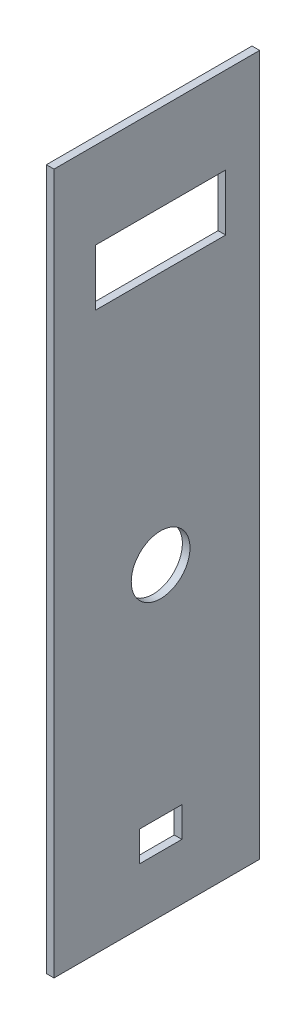
ISO-10303-21;
HEADER;
FILE_DESCRIPTION(('STEP AP214'),'2;1');
FILE_NAME('part.step','',(''),(''),'','','');
FILE_SCHEMA(('AUTOMOTIVE_DESIGN { 1 0 10303 214 1 1 1 1 }'));
ENDSEC;
DATA;
#1=APPLICATION_CONTEXT('core data for automotive mechanical design processes');
#2=APPLICATION_PROTOCOL_DEFINITION('international standard','automotive_design',2000,#1);
#3=PRODUCT_CONTEXT('',#1,'mechanical');
#4=PRODUCT('Part','Part','',(#3));
#5=PRODUCT_RELATED_PRODUCT_CATEGORY('part','',(#4));
#6=PRODUCT_DEFINITION_FORMATION('','',#4);
#7=PRODUCT_DEFINITION_CONTEXT('part definition',#1,'design');
#8=PRODUCT_DEFINITION('design','',#6,#7);
#9=PRODUCT_DEFINITION_SHAPE('','',#8);
#10=(LENGTH_UNIT() NAMED_UNIT(*) SI_UNIT(.MILLI.,.METRE.));
#11=(NAMED_UNIT(*) PLANE_ANGLE_UNIT() SI_UNIT($,.RADIAN.));
#12=(NAMED_UNIT(*) SI_UNIT($,.STERADIAN.) SOLID_ANGLE_UNIT());
#13=UNCERTAINTY_MEASURE_WITH_UNIT(LENGTH_MEASURE(1.E-05),#10,'distance_accuracy_value','');
#14=(GEOMETRIC_REPRESENTATION_CONTEXT(3) GLOBAL_UNCERTAINTY_ASSIGNED_CONTEXT((#13)) GLOBAL_UNIT_ASSIGNED_CONTEXT((#10,
#11,#12)) REPRESENTATION_CONTEXT('',''));
#15=CARTESIAN_POINT('',(0.,0.,0.));
#16=DIRECTION('',(0.,0.,1.));
#17=DIRECTION('',(1.,0.,0.));
#18=AXIS2_PLACEMENT_3D('',#15,#16,#17);
#19=CARTESIAN_POINT('',(3.175,0.,0.));
#20=DIRECTION('',(0.,1.,0.));
#21=DIRECTION('',(0.,0.,1.));
#22=AXIS2_PLACEMENT_3D('',#19,#20,#21);
#23=PLANE('',#22);
#24=DIRECTION('',(0.,0.,-1.));
#25=VECTOR('',#24,1.);
#26=CARTESIAN_POINT('',(0.,0.,0.));
#27=LINE('',#26,#25);
#28=CARTESIAN_POINT('',(0.,0.,3.17500000000001));
#29=VERTEX_POINT('',#28);
#30=CARTESIAN_POINT('',(0.,0.,-82.55));
#31=VERTEX_POINT('',#30);
#32=EDGE_CURVE('E146',#29,#31,#27,.T.);
#33=ORIENTED_EDGE('',*,*,#32,.T.);
#34=DIRECTION('',(-1.,0.,0.));
#35=VECTOR('',#34,1.);
#36=CARTESIAN_POINT('',(3.175,0.,-82.55));
#37=LINE('',#36,#35);
#38=CARTESIAN_POINT('',(3.175,0.,-82.55));
#39=VERTEX_POINT('',#38);
#40=EDGE_CURVE('E11',#39,#31,#37,.T.);
#41=ORIENTED_EDGE('',*,*,#40,.F.);
#42=DIRECTION('',(0.,0.,-1.));
#43=VECTOR('',#42,1.);
#44=CARTESIAN_POINT('',(3.175,0.,0.));
#45=LINE('',#44,#43);
#46=CARTESIAN_POINT('',(3.175,0.,3.17500000000001));
#47=VERTEX_POINT('',#46);
#48=EDGE_CURVE('E221',#47,#39,#45,.T.);
#49=ORIENTED_EDGE('',*,*,#48,.F.);
#50=DIRECTION('',(1.,0.,0.));
#51=VECTOR('',#50,1.);
#52=CARTESIAN_POINT('',(0.,0.,3.17500000000001));
#53=LINE('',#52,#51);
#54=EDGE_CURVE('E143',#29,#47,#53,.T.);
#55=ORIENTED_EDGE('',*,*,#54,.F.);
#56=EDGE_LOOP('',(#33,#41,#49,#55));
#57=FACE_BOUND('',#56,.T.);
#58=ADVANCED_FACE('F34',(#57),#23,.F.);
#59=CARTESIAN_POINT('',(3.175,0.,-82.55));
#60=DIRECTION('',(0.,0.,1.));
#61=DIRECTION('',(0.,-1.,0.));
#62=AXIS2_PLACEMENT_3D('',#59,#60,#61);
#63=PLANE('',#62);
#64=DIRECTION('',(0.,1.,0.));
#65=VECTOR('',#64,1.);
#66=CARTESIAN_POINT('',(0.,0.,-82.55));
#67=LINE('',#66,#65);
#68=CARTESIAN_POINT('',(0.,292.1,-82.5499999999999));
#69=VERTEX_POINT('',#68);
#70=EDGE_CURVE('E133',#31,#69,#67,.T.);
#71=ORIENTED_EDGE('',*,*,#70,.T.);
#72=DIRECTION('',(-1.,0.,0.));
#73=VECTOR('',#72,1.);
#74=CARTESIAN_POINT('',(3.175,292.1,-82.5499999999999));
#75=LINE('',#74,#73);
#76=CARTESIAN_POINT('',(3.175,292.1,-82.5499999999999));
#77=VERTEX_POINT('',#76);
#78=EDGE_CURVE('E38',#77,#69,#75,.T.);
#79=ORIENTED_EDGE('',*,*,#78,.F.);
#80=DIRECTION('',(0.,1.,0.));
#81=VECTOR('',#80,1.);
#82=CARTESIAN_POINT('',(3.175,0.,-82.55));
#83=LINE('',#82,#81);
#84=EDGE_CURVE('E219',#39,#77,#83,.T.);
#85=ORIENTED_EDGE('',*,*,#84,.F.);
#86=ORIENTED_EDGE('',*,*,#40,.T.);
#87=EDGE_LOOP('',(#71,#79,#85,#86));
#88=FACE_BOUND('',#87,.T.);
#89=ADVANCED_FACE('F228',(#88),#63,.F.);
#90=CARTESIAN_POINT('',(3.175,292.1,0.));
#91=DIRECTION('',(0.,1.,0.));
#92=DIRECTION('',(0.,0.,1.));
#93=AXIS2_PLACEMENT_3D('',#90,#91,#92);
#94=PLANE('',#93);
#95=DIRECTION('',(0.,0.,-1.));
#96=VECTOR('',#95,1.);
#97=CARTESIAN_POINT('',(0.,292.1,0.));
#98=LINE('',#97,#96);
#99=CARTESIAN_POINT('',(0.,292.1,3.17500000000001));
#100=VERTEX_POINT('',#99);
#101=EDGE_CURVE('E123',#100,#69,#98,.T.);
#102=ORIENTED_EDGE('',*,*,#101,.F.);
#103=DIRECTION('',(1.,0.,0.));
#104=VECTOR('',#103,1.);
#105=CARTESIAN_POINT('',(0.,292.1,3.17500000000001));
#106=LINE('',#105,#104);
#107=CARTESIAN_POINT('',(3.175,292.1,3.17500000000001));
#108=VERTEX_POINT('',#107);
#109=EDGE_CURVE('E126',#100,#108,#106,.T.);
#110=ORIENTED_EDGE('',*,*,#109,.T.);
#111=DIRECTION('',(0.,0.,-1.));
#112=VECTOR('',#111,1.);
#113=CARTESIAN_POINT('',(3.175,292.1,0.));
#114=LINE('',#113,#112);
#115=EDGE_CURVE('E217',#108,#77,#114,.T.);
#116=ORIENTED_EDGE('',*,*,#115,.T.);
#117=ORIENTED_EDGE('',*,*,#78,.T.);
#118=EDGE_LOOP('',(#102,#110,#116,#117));
#119=FACE_BOUND('',#118,.T.);
#120=ADVANCED_FACE('F36',(#119),#94,.T.);
#121=CARTESIAN_POINT('',(3.175,0.,0.));
#122=DIRECTION('',(-1.,0.,0.));
#123=DIRECTION('',(0.,0.,1.));
#124=AXIS2_PLACEMENT_3D('',#121,#122,#123);
#125=PLANE('',#124);
#126=DIRECTION('',(0.,0.,-1.));
#127=VECTOR('',#126,1.);
#128=CARTESIAN_POINT('',(3.175,232.5,-68.4));
#129=LINE('',#128,#127);
#130=CARTESIAN_POINT('',(3.175,232.5,-14.1499999999999));
#131=VERTEX_POINT('',#130);
#132=CARTESIAN_POINT('',(3.175,232.5,-68.4));
#133=VERTEX_POINT('',#132);
#134=EDGE_CURVE('E158',#131,#133,#129,.T.);
#135=ORIENTED_EDGE('',*,*,#134,.F.);
#136=DIRECTION('',(0.,-1.,0.));
#137=VECTOR('',#136,1.);
#138=CARTESIAN_POINT('',(3.175,232.5,-14.1499999999999));
#139=LINE('',#138,#137);
#140=CARTESIAN_POINT('',(3.175,256.,-14.1499999999999));
#141=VERTEX_POINT('',#140);
#142=EDGE_CURVE('E161',#141,#131,#139,.T.);
#143=ORIENTED_EDGE('',*,*,#142,.F.);
#144=DIRECTION('',(0.,0.,1.));
#145=VECTOR('',#144,1.);
#146=CARTESIAN_POINT('',(3.175,256.,-14.1499999999999));
#147=LINE('',#146,#145);
#148=CARTESIAN_POINT('',(3.175,256.,-68.4));
#149=VERTEX_POINT('',#148);
#150=EDGE_CURVE('E153',#149,#141,#147,.T.);
#151=ORIENTED_EDGE('',*,*,#150,.F.);
#152=DIRECTION('',(0.,1.,0.));
#153=VECTOR('',#152,1.);
#154=CARTESIAN_POINT('',(3.175,256.,-68.4));
#155=LINE('',#154,#153);
#156=EDGE_CURVE('E49',#133,#149,#155,.T.);
#157=ORIENTED_EDGE('',*,*,#156,.F.);
#158=EDGE_LOOP('',(#135,#143,#151,#157));
#159=FACE_BOUND('',#158,.T.);
#160=CARTESIAN_POINT('',(3.175,127.,-41.275));
#161=DIRECTION('',(-1.,0.,0.));
#162=DIRECTION('',(0.,0.,1.));
#163=AXIS2_PLACEMENT_3D('',#160,#161,#162);
#164=CIRCLE('',#163,12.25);
#165=CARTESIAN_POINT('',(3.175,127.,-29.025));
#166=VERTEX_POINT('',#165);
#167=EDGE_CURVE('E156',#166,#166,#164,.F.);
#168=ORIENTED_EDGE('',*,*,#167,.F.);
#169=EDGE_LOOP('',(#168));
#170=FACE_BOUND('',#169,.T.);
#171=DIRECTION('',(0.,0.,-1.));
#172=VECTOR('',#171,1.);
#173=CARTESIAN_POINT('',(3.175,23.4,-50.125));
#174=LINE('',#173,#172);
#175=CARTESIAN_POINT('',(3.175,23.4,-32.425));
#176=VERTEX_POINT('',#175);
#177=CARTESIAN_POINT('',(3.175,23.4,-50.125));
#178=VERTEX_POINT('',#177);
#179=EDGE_CURVE('E192',#176,#178,#174,.T.);
#180=ORIENTED_EDGE('',*,*,#179,.F.);
#181=DIRECTION('',(0.,-1.,0.));
#182=VECTOR('',#181,1.);
#183=CARTESIAN_POINT('',(3.175,23.4,-32.425));
#184=LINE('',#183,#182);
#185=CARTESIAN_POINT('',(3.175,35.95,-32.425));
#186=VERTEX_POINT('',#185);
#187=EDGE_CURVE('E195',#186,#176,#184,.T.);
#188=ORIENTED_EDGE('',*,*,#187,.F.);
#189=DIRECTION('',(0.,0.,1.));
#190=VECTOR('',#189,1.);
#191=CARTESIAN_POINT('',(3.175,35.95,-32.425));
#192=LINE('',#191,#190);
#193=CARTESIAN_POINT('',(3.175,35.95,-50.125));
#194=VERTEX_POINT('',#193);
#195=EDGE_CURVE('E151',#194,#186,#192,.T.);
#196=ORIENTED_EDGE('',*,*,#195,.F.);
#197=DIRECTION('',(0.,1.,0.));
#198=VECTOR('',#197,1.);
#199=CARTESIAN_POINT('',(3.175,35.95,-50.125));
#200=LINE('',#199,#198);
#201=EDGE_CURVE('E57',#178,#194,#200,.T.);
#202=ORIENTED_EDGE('',*,*,#201,.F.);
#203=EDGE_LOOP('',(#180,#188,#196,#202));
#204=FACE_BOUND('',#203,.T.);
#205=ORIENTED_EDGE('',*,*,#115,.F.);
#206=DIRECTION('',(0.,-1.,0.));
#207=VECTOR('',#206,1.);
#208=CARTESIAN_POINT('',(3.175,292.1,3.17500000000001));
#209=LINE('',#208,#207);
#210=EDGE_CURVE('E142',#108,#47,#209,.T.);
#211=ORIENTED_EDGE('',*,*,#210,.T.);
#212=ORIENTED_EDGE('',*,*,#48,.T.);
#213=ORIENTED_EDGE('',*,*,#84,.T.);
#214=EDGE_LOOP('',(#205,#211,#212,#213));
#215=FACE_BOUND('',#214,.T.);
#216=ADVANCED_FACE('F230',(#159,#170,#204,#215),#125,.F.);
#217=CARTESIAN_POINT('',(0.,0.,0.));
#218=DIRECTION('',(-1.,0.,0.));
#219=DIRECTION('',(0.,0.,1.));
#220=AXIS2_PLACEMENT_3D('',#217,#218,#219);
#221=PLANE('',#220);
#222=DIRECTION('',(0.,1.,0.));
#223=VECTOR('',#222,1.);
#224=CARTESIAN_POINT('',(0.,232.5,-14.1499999999999));
#225=LINE('',#224,#223);
#226=CARTESIAN_POINT('',(0.,232.5,-14.1499999999999));
#227=VERTEX_POINT('',#226);
#228=CARTESIAN_POINT('',(0.,256.,-14.1499999999999));
#229=VERTEX_POINT('',#228);
#230=EDGE_CURVE('E164',#227,#229,#225,.T.);
#231=ORIENTED_EDGE('',*,*,#230,.F.);
#232=DIRECTION('',(0.,0.,1.));
#233=VECTOR('',#232,1.);
#234=CARTESIAN_POINT('',(0.,232.5,-68.4));
#235=LINE('',#234,#233);
#236=CARTESIAN_POINT('',(0.,232.5,-68.4));
#237=VERTEX_POINT('',#236);
#238=EDGE_CURVE('E172',#237,#227,#235,.T.);
#239=ORIENTED_EDGE('',*,*,#238,.F.);
#240=DIRECTION('',(0.,-1.,0.));
#241=VECTOR('',#240,1.);
#242=CARTESIAN_POINT('',(0.,256.,-68.4));
#243=LINE('',#242,#241);
#244=CARTESIAN_POINT('',(0.,256.,-68.4));
#245=VERTEX_POINT('',#244);
#246=EDGE_CURVE('E169',#245,#237,#243,.T.);
#247=ORIENTED_EDGE('',*,*,#246,.F.);
#248=DIRECTION('',(0.,0.,-1.));
#249=VECTOR('',#248,1.);
#250=CARTESIAN_POINT('',(0.,256.,-14.1499999999999));
#251=LINE('',#250,#249);
#252=EDGE_CURVE('E166',#229,#245,#251,.T.);
#253=ORIENTED_EDGE('',*,*,#252,.F.);
#254=EDGE_LOOP('',(#231,#239,#247,#253));
#255=FACE_BOUND('',#254,.T.);
#256=CARTESIAN_POINT('',(0.,127.,-41.275));
#257=DIRECTION('',(-1.,0.,0.));
#258=DIRECTION('',(0.,0.,1.));
#259=AXIS2_PLACEMENT_3D('',#256,#257,#258);
#260=CIRCLE('',#259,12.25);
#261=CARTESIAN_POINT('',(0.,127.,-29.025));
#262=VERTEX_POINT('',#261);
#263=EDGE_CURVE('E185',#262,#262,#260,.T.);
#264=ORIENTED_EDGE('',*,*,#263,.F.);
#265=EDGE_LOOP('',(#264));
#266=FACE_BOUND('',#265,.T.);
#267=DIRECTION('',(0.,1.,0.));
#268=VECTOR('',#267,1.);
#269=CARTESIAN_POINT('',(0.,23.4,-32.425));
#270=LINE('',#269,#268);
#271=CARTESIAN_POINT('',(0.,23.4,-32.425));
#272=VERTEX_POINT('',#271);
#273=CARTESIAN_POINT('',(0.,35.95,-32.425));
#274=VERTEX_POINT('',#273);
#275=EDGE_CURVE('E198',#272,#274,#270,.T.);
#276=ORIENTED_EDGE('',*,*,#275,.F.);
#277=DIRECTION('',(0.,0.,1.));
#278=VECTOR('',#277,1.);
#279=CARTESIAN_POINT('',(0.,23.4,-50.125));
#280=LINE('',#279,#278);
#281=CARTESIAN_POINT('',(0.,23.4,-50.125));
#282=VERTEX_POINT('',#281);
#283=EDGE_CURVE('E206',#282,#272,#280,.T.);
#284=ORIENTED_EDGE('',*,*,#283,.F.);
#285=DIRECTION('',(0.,-1.,0.));
#286=VECTOR('',#285,1.);
#287=CARTESIAN_POINT('',(0.,35.95,-50.125));
#288=LINE('',#287,#286);
#289=CARTESIAN_POINT('',(0.,35.95,-50.125));
#290=VERTEX_POINT('',#289);
#291=EDGE_CURVE('E203',#290,#282,#288,.T.);
#292=ORIENTED_EDGE('',*,*,#291,.F.);
#293=DIRECTION('',(0.,0.,-1.));
#294=VECTOR('',#293,1.);
#295=CARTESIAN_POINT('',(0.,35.95,-32.425));
#296=LINE('',#295,#294);
#297=EDGE_CURVE('E200',#274,#290,#296,.T.);
#298=ORIENTED_EDGE('',*,*,#297,.F.);
#299=EDGE_LOOP('',(#276,#284,#292,#298));
#300=FACE_BOUND('',#299,.T.);
#301=ORIENTED_EDGE('',*,*,#32,.F.);
#302=DIRECTION('',(0.,-1.,0.));
#303=VECTOR('',#302,1.);
#304=CARTESIAN_POINT('',(0.,292.1,3.17500000000001));
#305=LINE('',#304,#303);
#306=EDGE_CURVE('E140',#100,#29,#305,.T.);
#307=ORIENTED_EDGE('',*,*,#306,.F.);
#308=ORIENTED_EDGE('',*,*,#101,.T.);
#309=ORIENTED_EDGE('',*,*,#70,.F.);
#310=EDGE_LOOP('',(#301,#307,#308,#309));
#311=FACE_BOUND('',#310,.T.);
#312=ADVANCED_FACE('F145',(#255,#266,#300,#311),#221,.T.);
#313=CARTESIAN_POINT('',(3.176,23.4,-32.425));
#314=DIRECTION('',(0.,0.,1.));
#315=DIRECTION('',(1.,0.,0.));
#316=AXIS2_PLACEMENT_3D('',#313,#314,#315);
#317=PLANE('',#316);
#318=ORIENTED_EDGE('',*,*,#187,.T.);
#319=DIRECTION('',(-1.,0.,0.));
#320=VECTOR('',#319,1.);
#321=CARTESIAN_POINT('',(3.176,23.4,-32.425));
#322=LINE('',#321,#320);
#323=EDGE_CURVE('E188',#176,#272,#322,.T.);
#324=ORIENTED_EDGE('',*,*,#323,.T.);
#325=ORIENTED_EDGE('',*,*,#275,.T.);
#326=DIRECTION('',(-1.,0.,0.));
#327=VECTOR('',#326,1.);
#328=CARTESIAN_POINT('',(3.176,35.95,-32.425));
#329=LINE('',#328,#327);
#330=EDGE_CURVE('E209',#186,#274,#329,.T.);
#331=ORIENTED_EDGE('',*,*,#330,.F.);
#332=EDGE_LOOP('',(#318,#324,#325,#331));
#333=FACE_BOUND('',#332,.T.);
#334=ADVANCED_FACE('F238',(#333),#317,.F.);
#335=CARTESIAN_POINT('',(3.176,23.4,-50.125));
#336=DIRECTION('',(0.,-1.,0.));
#337=DIRECTION('',(0.,0.,-1.));
#338=AXIS2_PLACEMENT_3D('',#335,#336,#337);
#339=PLANE('',#338);
#340=ORIENTED_EDGE('',*,*,#179,.T.);
#341=DIRECTION('',(-1.,0.,0.));
#342=VECTOR('',#341,1.);
#343=CARTESIAN_POINT('',(3.176,23.4,-50.125));
#344=LINE('',#343,#342);
#345=EDGE_CURVE('E211',#178,#282,#344,.T.);
#346=ORIENTED_EDGE('',*,*,#345,.T.);
#347=ORIENTED_EDGE('',*,*,#283,.T.);
#348=ORIENTED_EDGE('',*,*,#323,.F.);
#349=EDGE_LOOP('',(#340,#346,#347,#348));
#350=FACE_BOUND('',#349,.T.);
#351=ADVANCED_FACE('F336',(#350),#339,.F.);
#352=CARTESIAN_POINT('',(3.176,35.95,-50.125));
#353=DIRECTION('',(0.,0.,-1.));
#354=DIRECTION('',(-1.,0.,0.));
#355=AXIS2_PLACEMENT_3D('',#352,#353,#354);
#356=PLANE('',#355);
#357=ORIENTED_EDGE('',*,*,#201,.T.);
#358=DIRECTION('',(-1.,0.,0.));
#359=VECTOR('',#358,1.);
#360=CARTESIAN_POINT('',(3.176,35.95,-50.125));
#361=LINE('',#360,#359);
#362=EDGE_CURVE('E213',#194,#290,#361,.T.);
#363=ORIENTED_EDGE('',*,*,#362,.T.);
#364=ORIENTED_EDGE('',*,*,#291,.T.);
#365=ORIENTED_EDGE('',*,*,#345,.F.);
#366=EDGE_LOOP('',(#357,#363,#364,#365));
#367=FACE_BOUND('',#366,.T.);
#368=ADVANCED_FACE('F327',(#367),#356,.F.);
#369=CARTESIAN_POINT('',(3.176,35.95,-32.425));
#370=DIRECTION('',(0.,1.,0.));
#371=DIRECTION('',(0.,0.,1.));
#372=AXIS2_PLACEMENT_3D('',#369,#370,#371);
#373=PLANE('',#372);
#374=ORIENTED_EDGE('',*,*,#195,.T.);
#375=ORIENTED_EDGE('',*,*,#330,.T.);
#376=ORIENTED_EDGE('',*,*,#297,.T.);
#377=ORIENTED_EDGE('',*,*,#362,.F.);
#378=EDGE_LOOP('',(#374,#375,#376,#377));
#379=FACE_BOUND('',#378,.T.);
#380=ADVANCED_FACE('F318',(#379),#373,.F.);
#381=CARTESIAN_POINT('',(3.176,127.,-41.275));
#382=DIRECTION('',(-1.,0.,0.));
#383=DIRECTION('',(0.,0.,1.));
#384=AXIS2_PLACEMENT_3D('',#381,#382,#383);
#385=CYLINDRICAL_SURFACE('',#384,12.25);
#386=ORIENTED_EDGE('',*,*,#263,.T.);
#387=EDGE_LOOP('',(#386));
#388=FACE_BOUND('',#387,.T.);
#389=ORIENTED_EDGE('',*,*,#167,.T.);
#390=EDGE_LOOP('',(#389));
#391=FACE_BOUND('',#390,.T.);
#392=ADVANCED_FACE('F309',(#388,#391),#385,.F.);
#393=CARTESIAN_POINT('',(3.176,232.5,-14.1499999999999));
#394=DIRECTION('',(0.,0.,1.));
#395=DIRECTION('',(1.,0.,0.));
#396=AXIS2_PLACEMENT_3D('',#393,#394,#395);
#397=PLANE('',#396);
#398=ORIENTED_EDGE('',*,*,#142,.T.);
#399=DIRECTION('',(-1.,0.,0.));
#400=VECTOR('',#399,1.);
#401=CARTESIAN_POINT('',(3.176,232.5,-14.1499999999999));
#402=LINE('',#401,#400);
#403=EDGE_CURVE('E134',#131,#227,#402,.T.);
#404=ORIENTED_EDGE('',*,*,#403,.T.);
#405=ORIENTED_EDGE('',*,*,#230,.T.);
#406=DIRECTION('',(-1.,0.,0.));
#407=VECTOR('',#406,1.);
#408=CARTESIAN_POINT('',(3.176,256.,-14.1499999999999));
#409=LINE('',#408,#407);
#410=EDGE_CURVE('E175',#141,#229,#409,.T.);
#411=ORIENTED_EDGE('',*,*,#410,.F.);
#412=EDGE_LOOP('',(#398,#404,#405,#411));
#413=FACE_BOUND('',#412,.T.);
#414=ADVANCED_FACE('F300',(#413),#397,.F.);
#415=CARTESIAN_POINT('',(3.176,232.5,-68.4));
#416=DIRECTION('',(0.,-1.,0.));
#417=DIRECTION('',(0.,0.,-1.));
#418=AXIS2_PLACEMENT_3D('',#415,#416,#417);
#419=PLANE('',#418);
#420=ORIENTED_EDGE('',*,*,#134,.T.);
#421=DIRECTION('',(-1.,0.,0.));
#422=VECTOR('',#421,1.);
#423=CARTESIAN_POINT('',(3.176,232.5,-68.4));
#424=LINE('',#423,#422);
#425=EDGE_CURVE('E177',#133,#237,#424,.T.);
#426=ORIENTED_EDGE('',*,*,#425,.T.);
#427=ORIENTED_EDGE('',*,*,#238,.T.);
#428=ORIENTED_EDGE('',*,*,#403,.F.);
#429=EDGE_LOOP('',(#420,#426,#427,#428));
#430=FACE_BOUND('',#429,.T.);
#431=ADVANCED_FACE('F292',(#430),#419,.F.);
#432=CARTESIAN_POINT('',(3.176,256.,-68.4));
#433=DIRECTION('',(0.,0.,-1.));
#434=DIRECTION('',(-1.,0.,0.));
#435=AXIS2_PLACEMENT_3D('',#432,#433,#434);
#436=PLANE('',#435);
#437=ORIENTED_EDGE('',*,*,#156,.T.);
#438=DIRECTION('',(-1.,0.,0.));
#439=VECTOR('',#438,1.);
#440=CARTESIAN_POINT('',(3.176,256.,-68.4));
#441=LINE('',#440,#439);
#442=EDGE_CURVE('E179',#149,#245,#441,.T.);
#443=ORIENTED_EDGE('',*,*,#442,.T.);
#444=ORIENTED_EDGE('',*,*,#246,.T.);
#445=ORIENTED_EDGE('',*,*,#425,.F.);
#446=EDGE_LOOP('',(#437,#443,#444,#445));
#447=FACE_BOUND('',#446,.T.);
#448=ADVANCED_FACE('F283',(#447),#436,.F.);
#449=CARTESIAN_POINT('',(3.176,256.,-14.1499999999999));
#450=DIRECTION('',(0.,1.,0.));
#451=DIRECTION('',(0.,0.,1.));
#452=AXIS2_PLACEMENT_3D('',#449,#450,#451);
#453=PLANE('',#452);
#454=ORIENTED_EDGE('',*,*,#150,.T.);
#455=ORIENTED_EDGE('',*,*,#410,.T.);
#456=ORIENTED_EDGE('',*,*,#252,.T.);
#457=ORIENTED_EDGE('',*,*,#442,.F.);
#458=EDGE_LOOP('',(#454,#455,#456,#457));
#459=FACE_BOUND('',#458,.T.);
#460=ADVANCED_FACE('F274',(#459),#453,.F.);
#461=CARTESIAN_POINT('',(0.,292.1,3.17500000000001));
#462=DIRECTION('',(0.,0.,1.));
#463=DIRECTION('',(1.,0.,0.));
#464=AXIS2_PLACEMENT_3D('',#461,#462,#463);
#465=PLANE('',#464);
#466=ORIENTED_EDGE('',*,*,#210,.F.);
#467=ORIENTED_EDGE('',*,*,#109,.F.);
#468=ORIENTED_EDGE('',*,*,#306,.T.);
#469=ORIENTED_EDGE('',*,*,#54,.T.);
#470=EDGE_LOOP('',(#466,#467,#468,#469));
#471=FACE_BOUND('',#470,.T.);
#472=ADVANCED_FACE('F138',(#471),#465,.T.);
#473=CLOSED_SHELL('',(#58,#89,#120,#216,#312,#334,#351,#368,#380,#392,#414,#431,#448,#460,#472));
#474=MANIFOLD_SOLID_BREP('B2',#473);
#475=ADVANCED_BREP_SHAPE_REPRESENTATION('',(#18,#474),#14);
#476=SHAPE_DEFINITION_REPRESENTATION(#9,#475);
ENDSEC;
END-ISO-10303-21;
